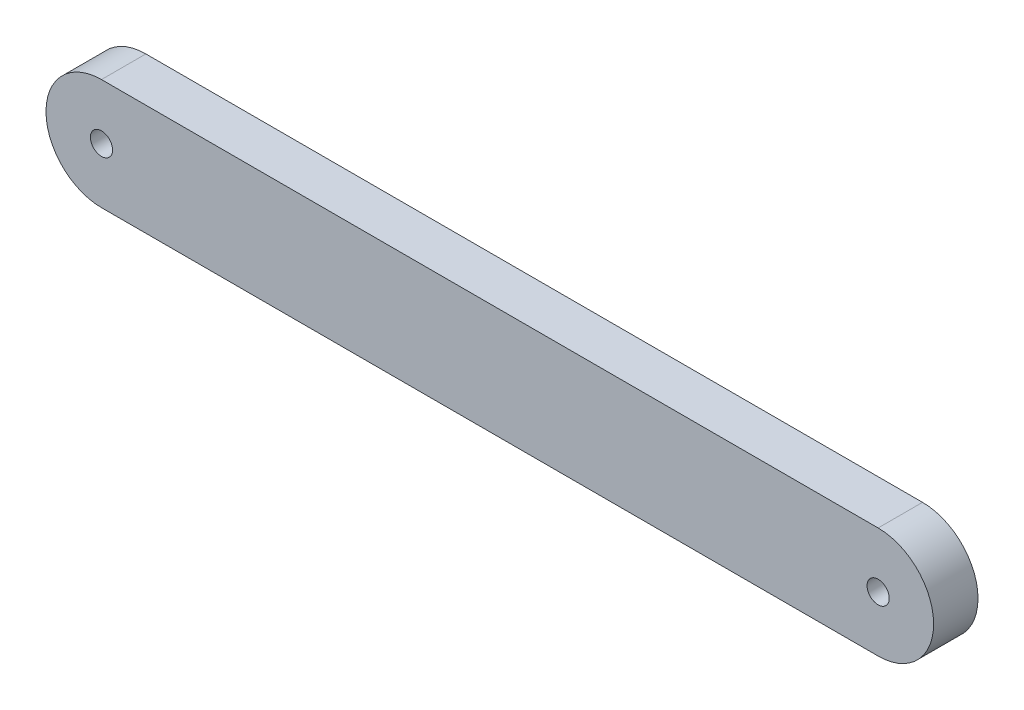
ISO-10303-21;
HEADER;
FILE_DESCRIPTION(('STEP AP214'),'2;1');
FILE_NAME('part.step','',(''),(''),'','','');
FILE_SCHEMA(('AUTOMOTIVE_DESIGN { 1 0 10303 214 1 1 1 1 }'));
ENDSEC;
DATA;
#1=APPLICATION_CONTEXT('core data for automotive mechanical design processes');
#2=APPLICATION_PROTOCOL_DEFINITION('international standard','automotive_design',2000,#1);
#3=PRODUCT_CONTEXT('',#1,'mechanical');
#4=PRODUCT('Part','Part','',(#3));
#5=PRODUCT_RELATED_PRODUCT_CATEGORY('part','',(#4));
#6=PRODUCT_DEFINITION_FORMATION('','',#4);
#7=PRODUCT_DEFINITION_CONTEXT('part definition',#1,'design');
#8=PRODUCT_DEFINITION('design','',#6,#7);
#9=PRODUCT_DEFINITION_SHAPE('','',#8);
#10=(LENGTH_UNIT() NAMED_UNIT(*) SI_UNIT(.MILLI.,.METRE.));
#11=(NAMED_UNIT(*) PLANE_ANGLE_UNIT() SI_UNIT($,.RADIAN.));
#12=(NAMED_UNIT(*) SI_UNIT($,.STERADIAN.) SOLID_ANGLE_UNIT());
#13=UNCERTAINTY_MEASURE_WITH_UNIT(LENGTH_MEASURE(1.E-05),#10,'distance_accuracy_value','');
#14=(GEOMETRIC_REPRESENTATION_CONTEXT(3) GLOBAL_UNCERTAINTY_ASSIGNED_CONTEXT((#13)) GLOBAL_UNIT_ASSIGNED_CONTEXT((#10,
#11,#12)) REPRESENTATION_CONTEXT('',''));
#15=CARTESIAN_POINT('',(0.,0.,0.));
#16=DIRECTION('',(0.,0.,1.));
#17=DIRECTION('',(1.,0.,0.));
#18=AXIS2_PLACEMENT_3D('',#15,#16,#17);
#19=CARTESIAN_POINT('',(-444.5,0.,50.8));
#20=DIRECTION('',(0.,0.,-1.));
#21=DIRECTION('',(-1.,0.,0.));
#22=AXIS2_PLACEMENT_3D('',#19,#20,#21);
#23=CYLINDRICAL_SURFACE('',#22,63.4999999999998);
#24=CARTESIAN_POINT('',(-444.5,0.,0.));
#25=DIRECTION('',(0.,0.,1.));
#26=DIRECTION('',(1.,0.,0.));
#27=AXIS2_PLACEMENT_3D('',#24,#25,#26);
#28=CIRCLE('',#27,63.4999999999998);
#29=CARTESIAN_POINT('',(-444.5,63.4999999999998,0.));
#30=VERTEX_POINT('',#29);
#31=CARTESIAN_POINT('',(-444.5,-63.4999999999998,0.));
#32=VERTEX_POINT('',#31);
#33=EDGE_CURVE('E107',#30,#32,#28,.T.);
#34=ORIENTED_EDGE('',*,*,#33,.T.);
#35=DIRECTION('',(0.,0.,-1.));
#36=VECTOR('',#35,1.);
#37=CARTESIAN_POINT('',(-444.5,-63.4999999999998,50.8));
#38=LINE('',#37,#36);
#39=CARTESIAN_POINT('',(-444.5,-63.4999999999998,50.8));
#40=VERTEX_POINT('',#39);
#41=EDGE_CURVE('E11',#40,#32,#38,.T.);
#42=ORIENTED_EDGE('',*,*,#41,.F.);
#43=CARTESIAN_POINT('',(-444.5,0.,50.8));
#44=DIRECTION('',(0.,0.,1.));
#45=DIRECTION('',(1.,0.,0.));
#46=AXIS2_PLACEMENT_3D('',#43,#44,#45);
#47=CIRCLE('',#46,63.4999999999998);
#48=CARTESIAN_POINT('',(-444.5,63.4999999999998,50.8));
#49=VERTEX_POINT('',#48);
#50=EDGE_CURVE('E91',#49,#40,#47,.T.);
#51=ORIENTED_EDGE('',*,*,#50,.F.);
#52=DIRECTION('',(0.,0.,-1.));
#53=VECTOR('',#52,1.);
#54=CARTESIAN_POINT('',(-444.5,63.4999999999998,50.8));
#55=LINE('',#54,#53);
#56=EDGE_CURVE('E103',#49,#30,#55,.T.);
#57=ORIENTED_EDGE('',*,*,#56,.T.);
#58=EDGE_LOOP('',(#34,#42,#51,#57));
#59=FACE_BOUND('',#58,.T.);
#60=ADVANCED_FACE('F39',(#59),#23,.T.);
#61=CARTESIAN_POINT('',(-444.5,-63.4999999999998,50.8));
#62=DIRECTION('',(0.,1.,0.));
#63=DIRECTION('',(-1.,0.,0.));
#64=AXIS2_PLACEMENT_3D('',#61,#62,#63);
#65=PLANE('',#64);
#66=DIRECTION('',(1.,0.,0.));
#67=VECTOR('',#66,1.);
#68=CARTESIAN_POINT('',(-444.5,-63.4999999999998,0.));
#69=LINE('',#68,#67);
#70=CARTESIAN_POINT('',(444.5,-63.4999999999998,0.));
#71=VERTEX_POINT('',#70);
#72=EDGE_CURVE('E96',#32,#71,#69,.T.);
#73=ORIENTED_EDGE('',*,*,#72,.T.);
#74=DIRECTION('',(0.,0.,-1.));
#75=VECTOR('',#74,1.);
#76=CARTESIAN_POINT('',(444.5,-63.4999999999998,50.8));
#77=LINE('',#76,#75);
#78=CARTESIAN_POINT('',(444.5,-63.4999999999998,50.8));
#79=VERTEX_POINT('',#78);
#80=EDGE_CURVE('E48',#79,#71,#77,.T.);
#81=ORIENTED_EDGE('',*,*,#80,.F.);
#82=DIRECTION('',(1.,0.,0.));
#83=VECTOR('',#82,1.);
#84=CARTESIAN_POINT('',(-444.5,-63.4999999999998,50.8));
#85=LINE('',#84,#83);
#86=EDGE_CURVE('E86',#40,#79,#85,.T.);
#87=ORIENTED_EDGE('',*,*,#86,.F.);
#88=ORIENTED_EDGE('',*,*,#41,.T.);
#89=EDGE_LOOP('',(#73,#81,#87,#88));
#90=FACE_BOUND('',#89,.T.);
#91=ADVANCED_FACE('F95',(#90),#65,.F.);
#92=CARTESIAN_POINT('',(444.5,0.,50.8));
#93=DIRECTION('',(0.,0.,-1.));
#94=DIRECTION('',(-1.,0.,0.));
#95=AXIS2_PLACEMENT_3D('',#92,#93,#94);
#96=CYLINDRICAL_SURFACE('',#95,63.4999999999998);
#97=CARTESIAN_POINT('',(444.5,0.,0.));
#98=DIRECTION('',(0.,0.,1.));
#99=DIRECTION('',(1.,0.,0.));
#100=AXIS2_PLACEMENT_3D('',#97,#98,#99);
#101=CIRCLE('',#100,63.4999999999998);
#102=CARTESIAN_POINT('',(444.5,63.5,0.));
#103=VERTEX_POINT('',#102);
#104=EDGE_CURVE('E73',#71,#103,#101,.T.);
#105=ORIENTED_EDGE('',*,*,#104,.T.);
#106=DIRECTION('',(0.,0.,-1.));
#107=VECTOR('',#106,1.);
#108=CARTESIAN_POINT('',(444.5,63.5,50.8));
#109=LINE('',#108,#107);
#110=CARTESIAN_POINT('',(444.5,63.5,50.8));
#111=VERTEX_POINT('',#110);
#112=EDGE_CURVE('E98',#111,#103,#109,.T.);
#113=ORIENTED_EDGE('',*,*,#112,.F.);
#114=CARTESIAN_POINT('',(444.5,0.,50.8));
#115=DIRECTION('',(0.,0.,1.));
#116=DIRECTION('',(1.,0.,0.));
#117=AXIS2_PLACEMENT_3D('',#114,#115,#116);
#118=CIRCLE('',#117,63.4999999999998);
#119=EDGE_CURVE('E89',#79,#111,#118,.T.);
#120=ORIENTED_EDGE('',*,*,#119,.F.);
#121=ORIENTED_EDGE('',*,*,#80,.T.);
#122=EDGE_LOOP('',(#105,#113,#120,#121));
#123=FACE_BOUND('',#122,.T.);
#124=ADVANCED_FACE('F99',(#123),#96,.T.);
#125=CARTESIAN_POINT('',(-444.5,63.4999999999998,50.8));
#126=DIRECTION('',(0.,-1.,0.));
#127=DIRECTION('',(1.,0.,0.));
#128=AXIS2_PLACEMENT_3D('',#125,#126,#127);
#129=PLANE('',#128);
#130=DIRECTION('',(-1.,0.,0.));
#131=VECTOR('',#130,1.);
#132=CARTESIAN_POINT('',(-444.5,63.4999999999998,0.));
#133=LINE('',#132,#131);
#134=EDGE_CURVE('E79',#103,#30,#133,.T.);
#135=ORIENTED_EDGE('',*,*,#134,.T.);
#136=ORIENTED_EDGE('',*,*,#56,.F.);
#137=DIRECTION('',(-1.,0.,0.));
#138=VECTOR('',#137,1.);
#139=CARTESIAN_POINT('',(-444.5,63.4999999999998,50.8));
#140=LINE('',#139,#138);
#141=EDGE_CURVE('E56',#111,#49,#140,.T.);
#142=ORIENTED_EDGE('',*,*,#141,.F.);
#143=ORIENTED_EDGE('',*,*,#112,.T.);
#144=EDGE_LOOP('',(#135,#136,#142,#143));
#145=FACE_BOUND('',#144,.T.);
#146=ADVANCED_FACE('F121',(#145),#129,.F.);
#147=CARTESIAN_POINT('',(-444.5,0.,50.8));
#148=DIRECTION('',(0.,0.,1.));
#149=DIRECTION('',(1.,0.,0.));
#150=AXIS2_PLACEMENT_3D('',#147,#148,#149);
#151=PLANE('',#150);
#152=CARTESIAN_POINT('',(-444.5,0.,50.8));
#153=DIRECTION('',(0.,0.,-1.));
#154=DIRECTION('',(-1.,0.,0.));
#155=AXIS2_PLACEMENT_3D('',#152,#153,#154);
#156=CIRCLE('',#155,12.7);
#157=CARTESIAN_POINT('',(-457.2,0.,50.8));
#158=VERTEX_POINT('',#157);
#159=EDGE_CURVE('E111',#158,#158,#156,.T.);
#160=ORIENTED_EDGE('',*,*,#159,.T.);
#161=EDGE_LOOP('',(#160));
#162=FACE_BOUND('',#161,.T.);
#163=CARTESIAN_POINT('',(444.5,0.,50.8));
#164=DIRECTION('',(0.,0.,-1.));
#165=DIRECTION('',(-1.,0.,0.));
#166=AXIS2_PLACEMENT_3D('',#163,#164,#165);
#167=CIRCLE('',#166,12.7);
#168=CARTESIAN_POINT('',(431.8,0.,50.8));
#169=VERTEX_POINT('',#168);
#170=EDGE_CURVE('E132',#169,#169,#167,.T.);
#171=ORIENTED_EDGE('',*,*,#170,.T.);
#172=EDGE_LOOP('',(#171));
#173=FACE_BOUND('',#172,.T.);
#174=ORIENTED_EDGE('',*,*,#50,.T.);
#175=ORIENTED_EDGE('',*,*,#86,.T.);
#176=ORIENTED_EDGE('',*,*,#119,.T.);
#177=ORIENTED_EDGE('',*,*,#141,.T.);
#178=EDGE_LOOP('',(#174,#175,#176,#177));
#179=FACE_BOUND('',#178,.T.);
#180=ADVANCED_FACE('F87',(#162,#173,#179),#151,.T.);
#181=CARTESIAN_POINT('',(-444.5,0.,0.));
#182=DIRECTION('',(0.,0.,1.));
#183=DIRECTION('',(1.,0.,0.));
#184=AXIS2_PLACEMENT_3D('',#181,#182,#183);
#185=PLANE('',#184);
#186=CARTESIAN_POINT('',(-444.5,0.,0.));
#187=DIRECTION('',(0.,0.,-1.));
#188=DIRECTION('',(-1.,0.,0.));
#189=AXIS2_PLACEMENT_3D('',#186,#187,#188);
#190=CIRCLE('',#189,12.7);
#191=CARTESIAN_POINT('',(-457.2,0.,0.));
#192=VERTEX_POINT('',#191);
#193=EDGE_CURVE('E136',#192,#192,#190,.T.);
#194=ORIENTED_EDGE('',*,*,#193,.F.);
#195=EDGE_LOOP('',(#194));
#196=FACE_BOUND('',#195,.T.);
#197=CARTESIAN_POINT('',(444.5,0.,0.));
#198=DIRECTION('',(0.,0.,-1.));
#199=DIRECTION('',(-1.,0.,0.));
#200=AXIS2_PLACEMENT_3D('',#197,#198,#199);
#201=CIRCLE('',#200,12.7);
#202=CARTESIAN_POINT('',(431.8,0.,0.));
#203=VERTEX_POINT('',#202);
#204=EDGE_CURVE('E128',#203,#203,#201,.T.);
#205=ORIENTED_EDGE('',*,*,#204,.F.);
#206=EDGE_LOOP('',(#205));
#207=FACE_BOUND('',#206,.T.);
#208=ORIENTED_EDGE('',*,*,#33,.F.);
#209=ORIENTED_EDGE('',*,*,#134,.F.);
#210=ORIENTED_EDGE('',*,*,#104,.F.);
#211=ORIENTED_EDGE('',*,*,#72,.F.);
#212=EDGE_LOOP('',(#208,#209,#210,#211));
#213=FACE_BOUND('',#212,.T.);
#214=ADVANCED_FACE('F124',(#196,#207,#213),#185,.F.);
#215=CARTESIAN_POINT('',(444.5,0.,50.8));
#216=DIRECTION('',(0.,0.,-1.));
#217=DIRECTION('',(-1.,0.,0.));
#218=AXIS2_PLACEMENT_3D('',#215,#216,#217);
#219=CYLINDRICAL_SURFACE('',#218,12.7);
#220=ORIENTED_EDGE('',*,*,#170,.F.);
#221=EDGE_LOOP('',(#220));
#222=FACE_BOUND('',#221,.T.);
#223=ORIENTED_EDGE('',*,*,#204,.T.);
#224=EDGE_LOOP('',(#223));
#225=FACE_BOUND('',#224,.T.);
#226=ADVANCED_FACE('F149',(#222,#225),#219,.F.);
#227=CARTESIAN_POINT('',(-444.5,0.,50.8));
#228=DIRECTION('',(0.,0.,-1.));
#229=DIRECTION('',(-1.,0.,0.));
#230=AXIS2_PLACEMENT_3D('',#227,#228,#229);
#231=CYLINDRICAL_SURFACE('',#230,12.7);
#232=ORIENTED_EDGE('',*,*,#159,.F.);
#233=EDGE_LOOP('',(#232));
#234=FACE_BOUND('',#233,.T.);
#235=ORIENTED_EDGE('',*,*,#193,.T.);
#236=EDGE_LOOP('',(#235));
#237=FACE_BOUND('',#236,.T.);
#238=ADVANCED_FACE('F146',(#234,#237),#231,.F.);
#239=CLOSED_SHELL('',(#60,#91,#124,#146,#180,#214,#226,#238));
#240=MANIFOLD_SOLID_BREP('B2',#239);
#241=ADVANCED_BREP_SHAPE_REPRESENTATION('',(#18,#240),#14);
#242=SHAPE_DEFINITION_REPRESENTATION(#9,#241);
ENDSEC;
END-ISO-10303-21;
